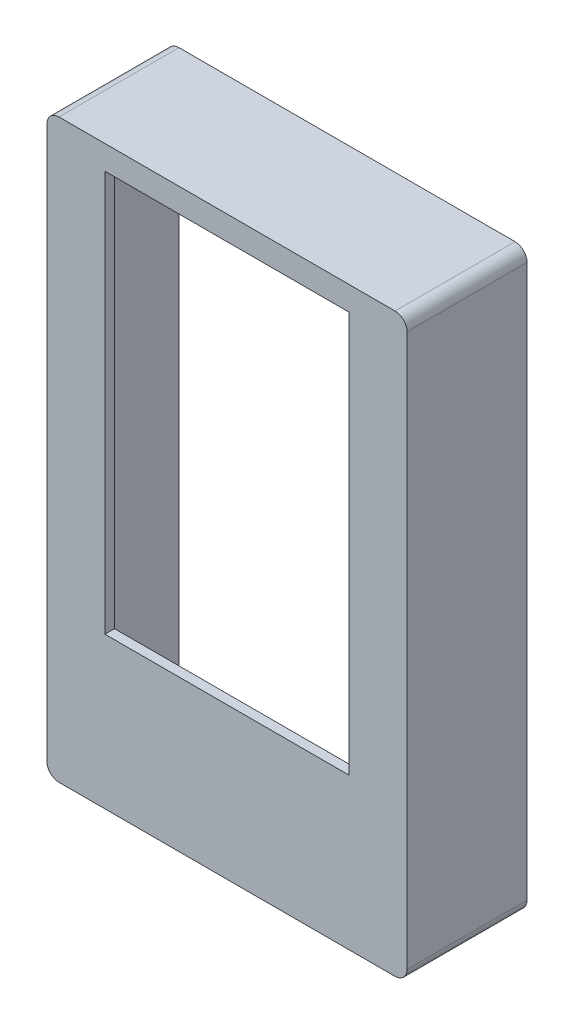
ISO-10303-21;
HEADER;
FILE_DESCRIPTION(('STEP AP214'),'2;1');
FILE_NAME('part.step','',(''),(''),'','','');
FILE_SCHEMA(('AUTOMOTIVE_DESIGN { 1 0 10303 214 1 1 1 1 }'));
ENDSEC;
DATA;
#1=APPLICATION_CONTEXT('core data for automotive mechanical design processes');
#2=APPLICATION_PROTOCOL_DEFINITION('international standard','automotive_design',2000,#1);
#3=PRODUCT_CONTEXT('',#1,'mechanical');
#4=PRODUCT('Part','Part','',(#3));
#5=PRODUCT_RELATED_PRODUCT_CATEGORY('part','',(#4));
#6=PRODUCT_DEFINITION_FORMATION('','',#4);
#7=PRODUCT_DEFINITION_CONTEXT('part definition',#1,'design');
#8=PRODUCT_DEFINITION('design','',#6,#7);
#9=PRODUCT_DEFINITION_SHAPE('','',#8);
#10=(LENGTH_UNIT() NAMED_UNIT(*) SI_UNIT(.MILLI.,.METRE.));
#11=(NAMED_UNIT(*) PLANE_ANGLE_UNIT() SI_UNIT($,.RADIAN.));
#12=(NAMED_UNIT(*) SI_UNIT($,.STERADIAN.) SOLID_ANGLE_UNIT());
#13=UNCERTAINTY_MEASURE_WITH_UNIT(LENGTH_MEASURE(1.E-05),#10,'distance_accuracy_value','');
#14=(GEOMETRIC_REPRESENTATION_CONTEXT(3) GLOBAL_UNCERTAINTY_ASSIGNED_CONTEXT((#13)) GLOBAL_UNIT_ASSIGNED_CONTEXT((#10,
#11,#12)) REPRESENTATION_CONTEXT('',''));
#15=CARTESIAN_POINT('',(0.,0.,0.));
#16=DIRECTION('',(0.,0.,1.));
#17=DIRECTION('',(1.,0.,0.));
#18=AXIS2_PLACEMENT_3D('',#15,#16,#17);
#19=CARTESIAN_POINT('',(0.,0.,50.));
#20=DIRECTION('',(0.,0.,1.));
#21=DIRECTION('',(1.,0.,0.));
#22=AXIS2_PLACEMENT_3D('',#19,#20,#21);
#23=PLANE('',#22);
#24=DIRECTION('',(1.,0.,0.));
#25=VECTOR('',#24,1.);
#26=CARTESIAN_POINT('',(75.,-120.,50.));
#27=LINE('',#26,#25);
#28=CARTESIAN_POINT('',(-70.,-120.,50.));
#29=VERTEX_POINT('',#28);
#30=CARTESIAN_POINT('',(70.,-120.,50.));
#31=VERTEX_POINT('',#30);
#32=EDGE_CURVE('E225',#29,#31,#27,.T.);
#33=ORIENTED_EDGE('',*,*,#32,.T.);
#34=CARTESIAN_POINT('',(70.,-115.,50.));
#35=DIRECTION('',(0.,0.,1.));
#36=DIRECTION('',(1.,0.,0.));
#37=AXIS2_PLACEMENT_3D('',#34,#35,#36);
#38=CIRCLE('',#37,5.);
#39=CARTESIAN_POINT('',(75.,-115.,50.));
#40=VERTEX_POINT('',#39);
#41=EDGE_CURVE('E273',#31,#40,#38,.T.);
#42=ORIENTED_EDGE('',*,*,#41,.T.);
#43=DIRECTION('',(0.,1.,0.));
#44=VECTOR('',#43,1.);
#45=CARTESIAN_POINT('',(75.,-120.,50.));
#46=LINE('',#45,#44);
#47=CARTESIAN_POINT('',(75.,115.,50.));
#48=VERTEX_POINT('',#47);
#49=EDGE_CURVE('E229',#40,#48,#46,.T.);
#50=ORIENTED_EDGE('',*,*,#49,.T.);
#51=CARTESIAN_POINT('',(70.,115.,50.));
#52=DIRECTION('',(0.,0.,1.));
#53=DIRECTION('',(1.,0.,0.));
#54=AXIS2_PLACEMENT_3D('',#51,#52,#53);
#55=CIRCLE('',#54,5.);
#56=CARTESIAN_POINT('',(70.,120.,50.));
#57=VERTEX_POINT('',#56);
#58=EDGE_CURVE('E63',#48,#57,#55,.T.);
#59=ORIENTED_EDGE('',*,*,#58,.T.);
#60=DIRECTION('',(-1.,0.,0.));
#61=VECTOR('',#60,1.);
#62=CARTESIAN_POINT('',(75.,120.,50.));
#63=LINE('',#62,#61);
#64=CARTESIAN_POINT('',(-70.,120.,50.));
#65=VERTEX_POINT('',#64);
#66=EDGE_CURVE('E231',#57,#65,#63,.T.);
#67=ORIENTED_EDGE('',*,*,#66,.T.);
#68=CARTESIAN_POINT('',(-70.,115.,50.));
#69=DIRECTION('',(0.,0.,1.));
#70=DIRECTION('',(1.,0.,0.));
#71=AXIS2_PLACEMENT_3D('',#68,#69,#70);
#72=CIRCLE('',#71,5.);
#73=CARTESIAN_POINT('',(-75.,115.,50.));
#74=VERTEX_POINT('',#73);
#75=EDGE_CURVE('E269',#65,#74,#72,.T.);
#76=ORIENTED_EDGE('',*,*,#75,.T.);
#77=DIRECTION('',(0.,-1.,0.));
#78=VECTOR('',#77,1.);
#79=CARTESIAN_POINT('',(-75.,-120.,50.));
#80=LINE('',#79,#78);
#81=CARTESIAN_POINT('',(-75.,-115.,50.));
#82=VERTEX_POINT('',#81);
#83=EDGE_CURVE('E222',#74,#82,#80,.T.);
#84=ORIENTED_EDGE('',*,*,#83,.T.);
#85=CARTESIAN_POINT('',(-70.,-115.,50.));
#86=DIRECTION('',(0.,0.,1.));
#87=DIRECTION('',(1.,0.,0.));
#88=AXIS2_PLACEMENT_3D('',#85,#86,#87);
#89=CIRCLE('',#88,5.);
#90=EDGE_CURVE('E271',#82,#29,#89,.T.);
#91=ORIENTED_EDGE('',*,*,#90,.T.);
#92=EDGE_LOOP('',(#33,#42,#50,#59,#67,#76,#84,#91));
#93=FACE_BOUND('',#92,.T.);
#94=DIRECTION('',(-1.,0.,0.));
#95=VECTOR('',#94,1.);
#96=CARTESIAN_POINT('',(0.,-57.,50.));
#97=LINE('',#96,#95);
#98=CARTESIAN_POINT('',(50.85,-57.,50.));
#99=VERTEX_POINT('',#98);
#100=CARTESIAN_POINT('',(-50.85,-57.,50.));
#101=VERTEX_POINT('',#100);
#102=EDGE_CURVE('E172',#99,#101,#97,.T.);
#103=ORIENTED_EDGE('',*,*,#102,.T.);
#104=DIRECTION('',(0.,1.,0.));
#105=VECTOR('',#104,1.);
#106=CARTESIAN_POINT('',(-50.85,0.,50.));
#107=LINE('',#106,#105);
#108=CARTESIAN_POINT('',(-50.85,110.,50.));
#109=VERTEX_POINT('',#108);
#110=EDGE_CURVE('E177',#101,#109,#107,.T.);
#111=ORIENTED_EDGE('',*,*,#110,.T.);
#112=DIRECTION('',(-1.,0.,0.));
#113=VECTOR('',#112,1.);
#114=CARTESIAN_POINT('',(0.,110.,50.));
#115=LINE('',#114,#113);
#116=CARTESIAN_POINT('',(50.85,110.,50.));
#117=VERTEX_POINT('',#116);
#118=EDGE_CURVE('E180',#117,#109,#115,.T.);
#119=ORIENTED_EDGE('',*,*,#118,.F.);
#120=DIRECTION('',(0.,1.,0.));
#121=VECTOR('',#120,1.);
#122=CARTESIAN_POINT('',(50.85,0.,50.));
#123=LINE('',#122,#121);
#124=EDGE_CURVE('E161',#99,#117,#123,.T.);
#125=ORIENTED_EDGE('',*,*,#124,.F.);
#126=EDGE_LOOP('',(#103,#111,#119,#125));
#127=FACE_BOUND('',#126,.T.);
#128=ADVANCED_FACE('F43',(#93,#127),#23,.T.);
#129=CARTESIAN_POINT('',(0.,0.,46.));
#130=DIRECTION('',(0.,0.,-1.));
#131=DIRECTION('',(-1.,0.,0.));
#132=AXIS2_PLACEMENT_3D('',#129,#130,#131);
#133=PLANE('',#132);
#134=DIRECTION('',(0.,-1.,0.));
#135=VECTOR('',#134,1.);
#136=CARTESIAN_POINT('',(70.,-115.,46.));
#137=LINE('',#136,#135);
#138=CARTESIAN_POINT('',(70.,115.,46.));
#139=VERTEX_POINT('',#138);
#140=CARTESIAN_POINT('',(70.,-115.,46.));
#141=VERTEX_POINT('',#140);
#142=EDGE_CURVE('E190',#139,#141,#137,.T.);
#143=ORIENTED_EDGE('',*,*,#142,.T.);
#144=DIRECTION('',(-1.,0.,0.));
#145=VECTOR('',#144,1.);
#146=CARTESIAN_POINT('',(-70.,-115.,46.));
#147=LINE('',#146,#145);
#148=CARTESIAN_POINT('',(-70.,-115.,46.));
#149=VERTEX_POINT('',#148);
#150=EDGE_CURVE('E193',#141,#149,#147,.T.);
#151=ORIENTED_EDGE('',*,*,#150,.T.);
#152=DIRECTION('',(0.,1.,0.));
#153=VECTOR('',#152,1.);
#154=CARTESIAN_POINT('',(-70.,-115.,46.));
#155=LINE('',#154,#153);
#156=CARTESIAN_POINT('',(-70.,115.,46.));
#157=VERTEX_POINT('',#156);
#158=EDGE_CURVE('E197',#149,#157,#155,.T.);
#159=ORIENTED_EDGE('',*,*,#158,.T.);
#160=DIRECTION('',(1.,0.,0.));
#161=VECTOR('',#160,1.);
#162=CARTESIAN_POINT('',(-70.,115.,46.));
#163=LINE('',#162,#161);
#164=EDGE_CURVE('E200',#157,#139,#163,.T.);
#165=ORIENTED_EDGE('',*,*,#164,.T.);
#166=EDGE_LOOP('',(#143,#151,#159,#165));
#167=FACE_BOUND('',#166,.T.);
#168=DIRECTION('',(1.,0.,0.));
#169=VECTOR('',#168,1.);
#170=CARTESIAN_POINT('',(0.,110.,46.));
#171=LINE('',#170,#169);
#172=CARTESIAN_POINT('',(-50.85,110.,46.));
#173=VERTEX_POINT('',#172);
#174=CARTESIAN_POINT('',(50.85,110.,46.));
#175=VERTEX_POINT('',#174);
#176=EDGE_CURVE('E245',#173,#175,#171,.T.);
#177=ORIENTED_EDGE('',*,*,#176,.F.);
#178=DIRECTION('',(0.,-1.,0.));
#179=VECTOR('',#178,1.);
#180=CARTESIAN_POINT('',(-50.85,0.,46.));
#181=LINE('',#180,#179);
#182=CARTESIAN_POINT('',(-50.85,-57.,46.));
#183=VERTEX_POINT('',#182);
#184=EDGE_CURVE('E247',#173,#183,#181,.T.);
#185=ORIENTED_EDGE('',*,*,#184,.T.);
#186=DIRECTION('',(1.,0.,0.));
#187=VECTOR('',#186,1.);
#188=CARTESIAN_POINT('',(0.,-57.,46.));
#189=LINE('',#188,#187);
#190=CARTESIAN_POINT('',(50.85,-57.,46.));
#191=VERTEX_POINT('',#190);
#192=EDGE_CURVE('E233',#183,#191,#189,.T.);
#193=ORIENTED_EDGE('',*,*,#192,.T.);
#194=DIRECTION('',(0.,-1.,0.));
#195=VECTOR('',#194,1.);
#196=CARTESIAN_POINT('',(50.85,0.,46.));
#197=LINE('',#196,#195);
#198=EDGE_CURVE('E164',#175,#191,#197,.T.);
#199=ORIENTED_EDGE('',*,*,#198,.F.);
#200=EDGE_LOOP('',(#177,#185,#193,#199));
#201=FACE_BOUND('',#200,.T.);
#202=ADVANCED_FACE('F318',(#167,#201),#133,.T.);
#203=CARTESIAN_POINT('',(-75.,-120.,50.));
#204=DIRECTION('',(1.,0.,0.));
#205=DIRECTION('',(0.,0.,-1.));
#206=AXIS2_PLACEMENT_3D('',#203,#204,#205);
#207=PLANE('',#206);
#208=DIRECTION('',(0.,-1.,0.));
#209=VECTOR('',#208,1.);
#210=CARTESIAN_POINT('',(-75.,-120.,0.));
#211=LINE('',#210,#209);
#212=CARTESIAN_POINT('',(-75.,115.,0.));
#213=VERTEX_POINT('',#212);
#214=CARTESIAN_POINT('',(-75.,-115.,0.));
#215=VERTEX_POINT('',#214);
#216=EDGE_CURVE('E215',#213,#215,#211,.T.);
#217=ORIENTED_EDGE('',*,*,#216,.T.);
#218=DIRECTION('',(0.,0.,-1.));
#219=VECTOR('',#218,1.);
#220=CARTESIAN_POINT('',(-75.,-115.,50.));
#221=LINE('',#220,#219);
#222=EDGE_CURVE('E278',#215,#82,#221,.F.);
#223=ORIENTED_EDGE('',*,*,#222,.T.);
#224=ORIENTED_EDGE('',*,*,#83,.F.);
#225=DIRECTION('',(0.,0.,-1.));
#226=VECTOR('',#225,1.);
#227=CARTESIAN_POINT('',(-75.,115.,50.));
#228=LINE('',#227,#226);
#229=EDGE_CURVE('E275',#74,#213,#228,.T.);
#230=ORIENTED_EDGE('',*,*,#229,.T.);
#231=EDGE_LOOP('',(#217,#223,#224,#230));
#232=FACE_BOUND('',#231,.T.);
#233=ADVANCED_FACE('F294',(#232),#207,.F.);
#234=CARTESIAN_POINT('',(75.,-120.,50.));
#235=DIRECTION('',(0.,1.,0.));
#236=DIRECTION('',(-1.,0.,0.));
#237=AXIS2_PLACEMENT_3D('',#234,#235,#236);
#238=PLANE('',#237);
#239=DIRECTION('',(1.,0.,0.));
#240=VECTOR('',#239,1.);
#241=CARTESIAN_POINT('',(75.,-120.,0.));
#242=LINE('',#241,#240);
#243=CARTESIAN_POINT('',(-70.,-120.,0.));
#244=VERTEX_POINT('',#243);
#245=CARTESIAN_POINT('',(70.,-120.,0.));
#246=VERTEX_POINT('',#245);
#247=EDGE_CURVE('E236',#244,#246,#242,.T.);
#248=ORIENTED_EDGE('',*,*,#247,.T.);
#249=DIRECTION('',(0.,0.,-1.));
#250=VECTOR('',#249,1.);
#251=CARTESIAN_POINT('',(70.,-120.,50.));
#252=LINE('',#251,#250);
#253=EDGE_CURVE('E266',#246,#31,#252,.F.);
#254=ORIENTED_EDGE('',*,*,#253,.T.);
#255=ORIENTED_EDGE('',*,*,#32,.F.);
#256=DIRECTION('',(0.,0.,-1.));
#257=VECTOR('',#256,1.);
#258=CARTESIAN_POINT('',(-70.,-120.,50.));
#259=LINE('',#258,#257);
#260=EDGE_CURVE('E263',#29,#244,#259,.T.);
#261=ORIENTED_EDGE('',*,*,#260,.T.);
#262=EDGE_LOOP('',(#248,#254,#255,#261));
#263=FACE_BOUND('',#262,.T.);
#264=ADVANCED_FACE('F303',(#263),#238,.F.);
#265=CARTESIAN_POINT('',(75.,-120.,50.));
#266=DIRECTION('',(-1.,0.,0.));
#267=DIRECTION('',(0.,0.,1.));
#268=AXIS2_PLACEMENT_3D('',#265,#266,#267);
#269=PLANE('',#268);
#270=ORIENTED_EDGE('',*,*,#49,.F.);
#271=DIRECTION('',(0.,0.,-1.));
#272=VECTOR('',#271,1.);
#273=CARTESIAN_POINT('',(75.,-115.,50.));
#274=LINE('',#273,#272);
#275=CARTESIAN_POINT('',(75.,-115.,0.));
#276=VERTEX_POINT('',#275);
#277=EDGE_CURVE('E252',#40,#276,#274,.T.);
#278=ORIENTED_EDGE('',*,*,#277,.T.);
#279=DIRECTION('',(0.,1.,0.));
#280=VECTOR('',#279,1.);
#281=CARTESIAN_POINT('',(75.,-120.,0.));
#282=LINE('',#281,#280);
#283=CARTESIAN_POINT('',(75.,115.,0.));
#284=VERTEX_POINT('',#283);
#285=EDGE_CURVE('E239',#276,#284,#282,.T.);
#286=ORIENTED_EDGE('',*,*,#285,.T.);
#287=DIRECTION('',(0.,0.,-1.));
#288=VECTOR('',#287,1.);
#289=CARTESIAN_POINT('',(75.,115.,50.));
#290=LINE('',#289,#288);
#291=EDGE_CURVE('E250',#284,#48,#290,.F.);
#292=ORIENTED_EDGE('',*,*,#291,.T.);
#293=EDGE_LOOP('',(#270,#278,#286,#292));
#294=FACE_BOUND('',#293,.T.);
#295=ADVANCED_FACE('F311',(#294),#269,.F.);
#296=CARTESIAN_POINT('',(75.,120.,50.));
#297=DIRECTION('',(0.,-1.,0.));
#298=DIRECTION('',(1.,0.,0.));
#299=AXIS2_PLACEMENT_3D('',#296,#297,#298);
#300=PLANE('',#299);
#301=DIRECTION('',(-1.,0.,0.));
#302=VECTOR('',#301,1.);
#303=CARTESIAN_POINT('',(75.,120.,0.));
#304=LINE('',#303,#302);
#305=CARTESIAN_POINT('',(70.,120.,0.));
#306=VERTEX_POINT('',#305);
#307=CARTESIAN_POINT('',(-70.,120.,0.));
#308=VERTEX_POINT('',#307);
#309=EDGE_CURVE('E226',#306,#308,#304,.T.);
#310=ORIENTED_EDGE('',*,*,#309,.T.);
#311=DIRECTION('',(0.,0.,-1.));
#312=VECTOR('',#311,1.);
#313=CARTESIAN_POINT('',(-70.,120.,50.));
#314=LINE('',#313,#312);
#315=EDGE_CURVE('E11',#308,#65,#314,.F.);
#316=ORIENTED_EDGE('',*,*,#315,.T.);
#317=ORIENTED_EDGE('',*,*,#66,.F.);
#318=DIRECTION('',(0.,0.,-1.));
#319=VECTOR('',#318,1.);
#320=CARTESIAN_POINT('',(70.,120.,50.));
#321=LINE('',#320,#319);
#322=EDGE_CURVE('E51',#57,#306,#321,.T.);
#323=ORIENTED_EDGE('',*,*,#322,.T.);
#324=EDGE_LOOP('',(#310,#316,#317,#323));
#325=FACE_BOUND('',#324,.T.);
#326=ADVANCED_FACE('F282',(#325),#300,.F.);
#327=CARTESIAN_POINT('',(0.,0.,0.));
#328=DIRECTION('',(0.,0.,1.));
#329=DIRECTION('',(1.,0.,0.));
#330=AXIS2_PLACEMENT_3D('',#327,#328,#329);
#331=PLANE('',#330);
#332=DIRECTION('',(-1.,0.,0.));
#333=VECTOR('',#332,1.);
#334=CARTESIAN_POINT('',(-70.,-115.,0.));
#335=LINE('',#334,#333);
#336=CARTESIAN_POINT('',(70.,-115.,0.));
#337=VERTEX_POINT('',#336);
#338=CARTESIAN_POINT('',(-70.,-115.,0.));
#339=VERTEX_POINT('',#338);
#340=EDGE_CURVE('E205',#337,#339,#335,.T.);
#341=ORIENTED_EDGE('',*,*,#340,.F.);
#342=DIRECTION('',(0.,-1.,0.));
#343=VECTOR('',#342,1.);
#344=CARTESIAN_POINT('',(70.,-115.,0.));
#345=LINE('',#344,#343);
#346=CARTESIAN_POINT('',(70.,115.,0.));
#347=VERTEX_POINT('',#346);
#348=EDGE_CURVE('E187',#347,#337,#345,.T.);
#349=ORIENTED_EDGE('',*,*,#348,.F.);
#350=DIRECTION('',(1.,0.,0.));
#351=VECTOR('',#350,1.);
#352=CARTESIAN_POINT('',(-70.,115.,0.));
#353=LINE('',#352,#351);
#354=CARTESIAN_POINT('',(-70.,115.,0.));
#355=VERTEX_POINT('',#354);
#356=EDGE_CURVE('E194',#355,#347,#353,.T.);
#357=ORIENTED_EDGE('',*,*,#356,.F.);
#358=DIRECTION('',(0.,1.,0.));
#359=VECTOR('',#358,1.);
#360=CARTESIAN_POINT('',(-70.,-115.,0.));
#361=LINE('',#360,#359);
#362=EDGE_CURVE('E208',#339,#355,#361,.T.);
#363=ORIENTED_EDGE('',*,*,#362,.F.);
#364=EDGE_LOOP('',(#341,#349,#357,#363));
#365=FACE_BOUND('',#364,.T.);
#366=ORIENTED_EDGE('',*,*,#285,.F.);
#367=CARTESIAN_POINT('',(70.,-115.,0.));
#368=DIRECTION('',(0.,0.,1.));
#369=DIRECTION('',(1.,0.,0.));
#370=AXIS2_PLACEMENT_3D('',#367,#368,#369);
#371=CIRCLE('',#370,5.);
#372=EDGE_CURVE('E261',#276,#246,#371,.F.);
#373=ORIENTED_EDGE('',*,*,#372,.T.);
#374=ORIENTED_EDGE('',*,*,#247,.F.);
#375=CARTESIAN_POINT('',(-70.,-115.,0.));
#376=DIRECTION('',(0.,0.,1.));
#377=DIRECTION('',(1.,0.,0.));
#378=AXIS2_PLACEMENT_3D('',#375,#376,#377);
#379=CIRCLE('',#378,5.);
#380=EDGE_CURVE('E259',#244,#215,#379,.F.);
#381=ORIENTED_EDGE('',*,*,#380,.T.);
#382=ORIENTED_EDGE('',*,*,#216,.F.);
#383=CARTESIAN_POINT('',(-70.,115.,0.));
#384=DIRECTION('',(0.,0.,1.));
#385=DIRECTION('',(1.,0.,0.));
#386=AXIS2_PLACEMENT_3D('',#383,#384,#385);
#387=CIRCLE('',#386,5.);
#388=EDGE_CURVE('E257',#213,#308,#387,.F.);
#389=ORIENTED_EDGE('',*,*,#388,.T.);
#390=ORIENTED_EDGE('',*,*,#309,.F.);
#391=CARTESIAN_POINT('',(70.,115.,0.));
#392=DIRECTION('',(0.,0.,1.));
#393=DIRECTION('',(1.,0.,0.));
#394=AXIS2_PLACEMENT_3D('',#391,#392,#393);
#395=CIRCLE('',#394,5.);
#396=EDGE_CURVE('E255',#306,#284,#395,.F.);
#397=ORIENTED_EDGE('',*,*,#396,.T.);
#398=EDGE_LOOP('',(#366,#373,#374,#381,#382,#389,#390,#397));
#399=FACE_BOUND('',#398,.T.);
#400=ADVANCED_FACE('F286',(#365,#399),#331,.F.);
#401=CARTESIAN_POINT('',(70.,-115.,46.));
#402=DIRECTION('',(1.,0.,0.));
#403=DIRECTION('',(0.,0.,-1.));
#404=AXIS2_PLACEMENT_3D('',#401,#402,#403);
#405=PLANE('',#404);
#406=ORIENTED_EDGE('',*,*,#348,.T.);
#407=DIRECTION('',(0.,0.,-1.));
#408=VECTOR('',#407,1.);
#409=CARTESIAN_POINT('',(70.,-115.,46.));
#410=LINE('',#409,#408);
#411=EDGE_CURVE('E203',#141,#337,#410,.T.);
#412=ORIENTED_EDGE('',*,*,#411,.F.);
#413=ORIENTED_EDGE('',*,*,#142,.F.);
#414=DIRECTION('',(0.,0.,-1.));
#415=VECTOR('',#414,1.);
#416=CARTESIAN_POINT('',(70.,115.,46.));
#417=LINE('',#416,#415);
#418=EDGE_CURVE('E213',#139,#347,#417,.T.);
#419=ORIENTED_EDGE('',*,*,#418,.T.);
#420=EDGE_LOOP('',(#406,#412,#413,#419));
#421=FACE_BOUND('',#420,.T.);
#422=ADVANCED_FACE('F329',(#421),#405,.F.);
#423=CARTESIAN_POINT('',(-70.,115.,46.));
#424=DIRECTION('',(0.,1.,0.));
#425=DIRECTION('',(0.,0.,1.));
#426=AXIS2_PLACEMENT_3D('',#423,#424,#425);
#427=PLANE('',#426);
#428=ORIENTED_EDGE('',*,*,#356,.T.);
#429=ORIENTED_EDGE('',*,*,#418,.F.);
#430=ORIENTED_EDGE('',*,*,#164,.F.);
#431=DIRECTION('',(0.,0.,-1.));
#432=VECTOR('',#431,1.);
#433=CARTESIAN_POINT('',(-70.,115.,46.));
#434=LINE('',#433,#432);
#435=EDGE_CURVE('E216',#157,#355,#434,.T.);
#436=ORIENTED_EDGE('',*,*,#435,.T.);
#437=EDGE_LOOP('',(#428,#429,#430,#436));
#438=FACE_BOUND('',#437,.T.);
#439=ADVANCED_FACE('F421',(#438),#427,.F.);
#440=CARTESIAN_POINT('',(-70.,-115.,46.));
#441=DIRECTION('',(-1.,0.,0.));
#442=DIRECTION('',(0.,0.,1.));
#443=AXIS2_PLACEMENT_3D('',#440,#441,#442);
#444=PLANE('',#443);
#445=ORIENTED_EDGE('',*,*,#362,.T.);
#446=ORIENTED_EDGE('',*,*,#435,.F.);
#447=ORIENTED_EDGE('',*,*,#158,.F.);
#448=DIRECTION('',(0.,0.,-1.));
#449=VECTOR('',#448,1.);
#450=CARTESIAN_POINT('',(-70.,-115.,46.));
#451=LINE('',#450,#449);
#452=EDGE_CURVE('E218',#149,#339,#451,.T.);
#453=ORIENTED_EDGE('',*,*,#452,.T.);
#454=EDGE_LOOP('',(#445,#446,#447,#453));
#455=FACE_BOUND('',#454,.T.);
#456=ADVANCED_FACE('F413',(#455),#444,.F.);
#457=CARTESIAN_POINT('',(-70.,-115.,46.));
#458=DIRECTION('',(0.,-1.,0.));
#459=DIRECTION('',(0.,0.,-1.));
#460=AXIS2_PLACEMENT_3D('',#457,#458,#459);
#461=PLANE('',#460);
#462=ORIENTED_EDGE('',*,*,#340,.T.);
#463=ORIENTED_EDGE('',*,*,#452,.F.);
#464=ORIENTED_EDGE('',*,*,#150,.F.);
#465=ORIENTED_EDGE('',*,*,#411,.T.);
#466=EDGE_LOOP('',(#462,#463,#464,#465));
#467=FACE_BOUND('',#466,.T.);
#468=ADVANCED_FACE('F393',(#467),#461,.F.);
#469=CARTESIAN_POINT('',(-50.85,0.,0.));
#470=DIRECTION('',(1.,0.,0.));
#471=DIRECTION('',(0.,0.,-1.));
#472=AXIS2_PLACEMENT_3D('',#469,#470,#471);
#473=PLANE('',#472);
#474=DIRECTION('',(0.,0.,1.));
#475=VECTOR('',#474,1.);
#476=CARTESIAN_POINT('',(-50.85,110.,0.));
#477=LINE('',#476,#475);
#478=EDGE_CURVE('E185',#173,#109,#477,.T.);
#479=ORIENTED_EDGE('',*,*,#478,.T.);
#480=ORIENTED_EDGE('',*,*,#110,.F.);
#481=DIRECTION('',(0.,0.,1.));
#482=VECTOR('',#481,1.);
#483=CARTESIAN_POINT('',(-50.85,-57.,0.));
#484=LINE('',#483,#482);
#485=EDGE_CURVE('E168',#183,#101,#484,.T.);
#486=ORIENTED_EDGE('',*,*,#485,.F.);
#487=ORIENTED_EDGE('',*,*,#184,.F.);
#488=EDGE_LOOP('',(#479,#480,#486,#487));
#489=FACE_BOUND('',#488,.T.);
#490=ADVANCED_FACE('F385',(#489),#473,.T.);
#491=CARTESIAN_POINT('',(0.,110.,0.));
#492=DIRECTION('',(0.,1.,0.));
#493=DIRECTION('',(0.,0.,1.));
#494=AXIS2_PLACEMENT_3D('',#491,#492,#493);
#495=PLANE('',#494);
#496=ORIENTED_EDGE('',*,*,#176,.T.);
#497=DIRECTION('',(0.,0.,1.));
#498=VECTOR('',#497,1.);
#499=CARTESIAN_POINT('',(50.85,110.,0.));
#500=LINE('',#499,#498);
#501=EDGE_CURVE('E167',#175,#117,#500,.T.);
#502=ORIENTED_EDGE('',*,*,#501,.T.);
#503=ORIENTED_EDGE('',*,*,#118,.T.);
#504=ORIENTED_EDGE('',*,*,#478,.F.);
#505=EDGE_LOOP('',(#496,#502,#503,#504));
#506=FACE_BOUND('',#505,.T.);
#507=ADVANCED_FACE('F377',(#506),#495,.F.);
#508=CARTESIAN_POINT('',(50.85,0.,0.));
#509=DIRECTION('',(1.,0.,0.));
#510=DIRECTION('',(0.,0.,-1.));
#511=AXIS2_PLACEMENT_3D('',#508,#509,#510);
#512=PLANE('',#511);
#513=ORIENTED_EDGE('',*,*,#198,.T.);
#514=DIRECTION('',(0.,0.,1.));
#515=VECTOR('',#514,1.);
#516=CARTESIAN_POINT('',(50.85,-57.,0.));
#517=LINE('',#516,#515);
#518=EDGE_CURVE('E156',#191,#99,#517,.T.);
#519=ORIENTED_EDGE('',*,*,#518,.T.);
#520=ORIENTED_EDGE('',*,*,#124,.T.);
#521=ORIENTED_EDGE('',*,*,#501,.F.);
#522=EDGE_LOOP('',(#513,#519,#520,#521));
#523=FACE_BOUND('',#522,.T.);
#524=ADVANCED_FACE('F158',(#523),#512,.F.);
#525=CARTESIAN_POINT('',(0.,-57.,0.));
#526=DIRECTION('',(0.,1.,0.));
#527=DIRECTION('',(-1.,0.,0.));
#528=AXIS2_PLACEMENT_3D('',#525,#526,#527);
#529=PLANE('',#528);
#530=ORIENTED_EDGE('',*,*,#485,.T.);
#531=ORIENTED_EDGE('',*,*,#102,.F.);
#532=ORIENTED_EDGE('',*,*,#518,.F.);
#533=ORIENTED_EDGE('',*,*,#192,.F.);
#534=EDGE_LOOP('',(#530,#531,#532,#533));
#535=FACE_BOUND('',#534,.T.);
#536=ADVANCED_FACE('F173',(#535),#529,.T.);
#537=CARTESIAN_POINT('',(70.,-115.,50.));
#538=DIRECTION('',(0.,0.,-1.));
#539=DIRECTION('',(-1.,0.,0.));
#540=AXIS2_PLACEMENT_3D('',#537,#538,#539);
#541=CYLINDRICAL_SURFACE('',#540,5.);
#542=ORIENTED_EDGE('',*,*,#41,.F.);
#543=ORIENTED_EDGE('',*,*,#253,.F.);
#544=ORIENTED_EDGE('',*,*,#372,.F.);
#545=ORIENTED_EDGE('',*,*,#277,.F.);
#546=EDGE_LOOP('',(#542,#543,#544,#545));
#547=FACE_BOUND('',#546,.T.);
#548=ADVANCED_FACE('F308',(#547),#541,.T.);
#549=CARTESIAN_POINT('',(-70.,-115.,50.));
#550=DIRECTION('',(0.,0.,-1.));
#551=DIRECTION('',(-1.,0.,0.));
#552=AXIS2_PLACEMENT_3D('',#549,#550,#551);
#553=CYLINDRICAL_SURFACE('',#552,5.);
#554=ORIENTED_EDGE('',*,*,#90,.F.);
#555=ORIENTED_EDGE('',*,*,#222,.F.);
#556=ORIENTED_EDGE('',*,*,#380,.F.);
#557=ORIENTED_EDGE('',*,*,#260,.F.);
#558=EDGE_LOOP('',(#554,#555,#556,#557));
#559=FACE_BOUND('',#558,.T.);
#560=ADVANCED_FACE('F300',(#559),#553,.T.);
#561=CARTESIAN_POINT('',(-70.,115.,50.));
#562=DIRECTION('',(0.,0.,-1.));
#563=DIRECTION('',(-1.,0.,0.));
#564=AXIS2_PLACEMENT_3D('',#561,#562,#563);
#565=CYLINDRICAL_SURFACE('',#564,5.);
#566=ORIENTED_EDGE('',*,*,#75,.F.);
#567=ORIENTED_EDGE('',*,*,#315,.F.);
#568=ORIENTED_EDGE('',*,*,#388,.F.);
#569=ORIENTED_EDGE('',*,*,#229,.F.);
#570=EDGE_LOOP('',(#566,#567,#568,#569));
#571=FACE_BOUND('',#570,.T.);
#572=ADVANCED_FACE('F291',(#571),#565,.T.);
#573=CARTESIAN_POINT('',(70.,115.,50.));
#574=DIRECTION('',(0.,0.,-1.));
#575=DIRECTION('',(-1.,0.,0.));
#576=AXIS2_PLACEMENT_3D('',#573,#574,#575);
#577=CYLINDRICAL_SURFACE('',#576,5.);
#578=ORIENTED_EDGE('',*,*,#58,.F.);
#579=ORIENTED_EDGE('',*,*,#291,.F.);
#580=ORIENTED_EDGE('',*,*,#396,.F.);
#581=ORIENTED_EDGE('',*,*,#322,.F.);
#582=EDGE_LOOP('',(#578,#579,#580,#581));
#583=FACE_BOUND('',#582,.T.);
#584=ADVANCED_FACE('F45',(#583),#577,.T.);
#585=CLOSED_SHELL('',(#128,#202,#233,#264,#295,#326,#400,#422,#439,#456,#468,#490,#507,#524,
#536,#548,#560,#572,#584));
#586=MANIFOLD_SOLID_BREP('B2',#585);
#587=ADVANCED_BREP_SHAPE_REPRESENTATION('',(#18,#586),#14);
#588=SHAPE_DEFINITION_REPRESENTATION(#9,#587);
ENDSEC;
END-ISO-10303-21;
